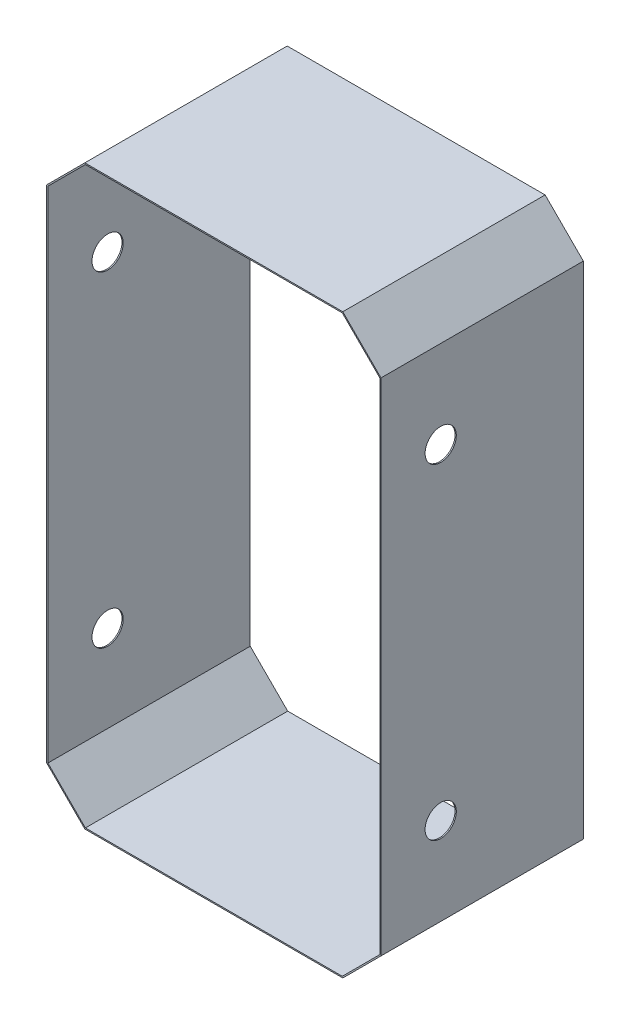
ISO-10303-21;
HEADER;
FILE_DESCRIPTION(('STEP AP214'),'2;1');
FILE_NAME('part.step','',(''),(''),'','','');
FILE_SCHEMA(('AUTOMOTIVE_DESIGN { 1 0 10303 214 1 1 1 1 }'));
ENDSEC;
DATA;
#1=APPLICATION_CONTEXT('core data for automotive mechanical design processes');
#2=APPLICATION_PROTOCOL_DEFINITION('international standard','automotive_design',2000,#1);
#3=PRODUCT_CONTEXT('',#1,'mechanical');
#4=PRODUCT('Part','Part','',(#3));
#5=PRODUCT_RELATED_PRODUCT_CATEGORY('part','',(#4));
#6=PRODUCT_DEFINITION_FORMATION('','',#4);
#7=PRODUCT_DEFINITION_CONTEXT('part definition',#1,'design');
#8=PRODUCT_DEFINITION('design','',#6,#7);
#9=PRODUCT_DEFINITION_SHAPE('','',#8);
#10=(LENGTH_UNIT() NAMED_UNIT(*) SI_UNIT(.MILLI.,.METRE.));
#11=(NAMED_UNIT(*) PLANE_ANGLE_UNIT() SI_UNIT($,.RADIAN.));
#12=(NAMED_UNIT(*) SI_UNIT($,.STERADIAN.) SOLID_ANGLE_UNIT());
#13=UNCERTAINTY_MEASURE_WITH_UNIT(LENGTH_MEASURE(1.E-05),#10,'distance_accuracy_value','');
#14=(GEOMETRIC_REPRESENTATION_CONTEXT(3) GLOBAL_UNCERTAINTY_ASSIGNED_CONTEXT((#13)) GLOBAL_UNIT_ASSIGNED_CONTEXT((#10,
#11,#12)) REPRESENTATION_CONTEXT('',''));
#15=CARTESIAN_POINT('',(0.,0.,0.));
#16=DIRECTION('',(0.,0.,1.));
#17=DIRECTION('',(1.,0.,0.));
#18=AXIS2_PLACEMENT_3D('',#15,#16,#17);
#19=CARTESIAN_POINT('',(0.,0.,162.));
#20=DIRECTION('',(0.,0.,-1.));
#21=DIRECTION('',(-1.,0.,0.));
#22=AXIS2_PLACEMENT_3D('',#19,#20,#21);
#23=PLANE('',#22);
#24=DIRECTION('',(0.,-1.,0.));
#25=VECTOR('',#24,1.);
#26=CARTESIAN_POINT('',(-57.7395039431081,-238.05581759051,162.));
#27=LINE('',#26,#25);
#28=CARTESIAN_POINT('',(-57.7395039431081,162.772609534235,162.));
#29=VERTEX_POINT('',#28);
#30=CARTESIAN_POINT('',(-57.7395039431081,-238.05581759051,162.));
#31=VERTEX_POINT('',#30);
#32=EDGE_CURVE('E216',#29,#31,#27,.T.);
#33=ORIENTED_EDGE('',*,*,#32,.T.);
#34=DIRECTION('',(0.707106781186553,-0.707106781186542,0.));
#35=VECTOR('',#34,1.);
#36=CARTESIAN_POINT('',(-27.1537175054806,-268.641604028137,162.));
#37=LINE('',#36,#35);
#38=CARTESIAN_POINT('',(-27.1537175054806,-268.641604028137,162.));
#39=VERTEX_POINT('',#38);
#40=EDGE_CURVE('E219',#31,#39,#37,.T.);
#41=ORIENTED_EDGE('',*,*,#40,.T.);
#42=DIRECTION('',(1.,0.,0.));
#43=VECTOR('',#42,1.);
#44=CARTESIAN_POINT('',(179.374709619265,-268.641604028137,162.));
#45=LINE('',#44,#43);
#46=CARTESIAN_POINT('',(179.374709619265,-268.641604028137,162.));
#47=VERTEX_POINT('',#46);
#48=EDGE_CURVE('E222',#39,#47,#45,.T.);
#49=ORIENTED_EDGE('',*,*,#48,.T.);
#50=DIRECTION('',(0.707106781186542,0.707106781186553,0.));
#51=VECTOR('',#50,1.);
#52=CARTESIAN_POINT('',(209.960496056892,-238.055817590509,162.));
#53=LINE('',#52,#51);
#54=CARTESIAN_POINT('',(209.960496056892,-238.055817590509,162.));
#55=VERTEX_POINT('',#54);
#56=EDGE_CURVE('E224',#47,#55,#53,.T.);
#57=ORIENTED_EDGE('',*,*,#56,.T.);
#58=DIRECTION('',(0.,1.,0.));
#59=VECTOR('',#58,1.);
#60=CARTESIAN_POINT('',(209.960496056892,162.772609534236,162.));
#61=LINE('',#60,#59);
#62=CARTESIAN_POINT('',(209.960496056892,162.772609534236,162.));
#63=VERTEX_POINT('',#62);
#64=EDGE_CURVE('E226',#55,#63,#61,.T.);
#65=ORIENTED_EDGE('',*,*,#64,.T.);
#66=DIRECTION('',(-0.707106781186553,0.707106781186542,0.));
#67=VECTOR('',#66,1.);
#68=CARTESIAN_POINT('',(179.374709619265,193.358395971863,162.));
#69=LINE('',#68,#67);
#70=CARTESIAN_POINT('',(179.374709619265,193.358395971863,162.));
#71=VERTEX_POINT('',#70);
#72=EDGE_CURVE('E228',#63,#71,#69,.T.);
#73=ORIENTED_EDGE('',*,*,#72,.T.);
#74=DIRECTION('',(-1.,0.,0.));
#75=VECTOR('',#74,1.);
#76=CARTESIAN_POINT('',(-27.1537175054807,193.358395971863,162.));
#77=LINE('',#76,#75);
#78=CARTESIAN_POINT('',(-27.1537175054807,193.358395971863,162.));
#79=VERTEX_POINT('',#78);
#80=EDGE_CURVE('E230',#71,#79,#77,.T.);
#81=ORIENTED_EDGE('',*,*,#80,.T.);
#82=DIRECTION('',(-0.707106781186543,-0.707106781186552,0.));
#83=VECTOR('',#82,1.);
#84=CARTESIAN_POINT('',(-57.7395039431081,162.772609534235,162.));
#85=LINE('',#84,#83);
#86=EDGE_CURVE('E232',#79,#29,#85,.T.);
#87=ORIENTED_EDGE('',*,*,#86,.T.);
#88=EDGE_LOOP('',(#33,#41,#49,#57,#65,#73,#81,#87));
#89=FACE_BOUND('',#88,.T.);
#90=DIRECTION('',(0.,-1.,0.));
#91=VECTOR('',#90,1.);
#92=CARTESIAN_POINT('',(-56.7395039431081,-237.641604028137,162.));
#93=LINE('',#92,#91);
#94=CARTESIAN_POINT('',(-56.7395039431081,162.358395971862,162.));
#95=VERTEX_POINT('',#94);
#96=CARTESIAN_POINT('',(-56.7395039431081,-237.641604028137,162.));
#97=VERTEX_POINT('',#96);
#98=EDGE_CURVE('E149',#95,#97,#93,.T.);
#99=ORIENTED_EDGE('',*,*,#98,.F.);
#100=DIRECTION('',(-0.707106781186542,-0.707106781186553,0.));
#101=VECTOR('',#100,1.);
#102=CARTESIAN_POINT('',(-56.7395039431081,162.358395971862,162.));
#103=LINE('',#102,#101);
#104=CARTESIAN_POINT('',(-26.7395039431077,192.358395971863,162.));
#105=VERTEX_POINT('',#104);
#106=EDGE_CURVE('E183',#105,#95,#103,.T.);
#107=ORIENTED_EDGE('',*,*,#106,.F.);
#108=DIRECTION('',(-1.,0.,0.));
#109=VECTOR('',#108,1.);
#110=CARTESIAN_POINT('',(-26.7395039431076,192.358395971863,162.));
#111=LINE('',#110,#109);
#112=CARTESIAN_POINT('',(178.960496056892,192.358395971863,162.));
#113=VERTEX_POINT('',#112);
#114=EDGE_CURVE('E181',#113,#105,#111,.T.);
#115=ORIENTED_EDGE('',*,*,#114,.F.);
#116=DIRECTION('',(-0.707106781186558,0.707106781186537,0.));
#117=VECTOR('',#116,1.);
#118=CARTESIAN_POINT('',(178.960496056892,192.358395971863,162.));
#119=LINE('',#118,#117);
#120=CARTESIAN_POINT('',(208.960496056892,162.358395971864,162.));
#121=VERTEX_POINT('',#120);
#122=EDGE_CURVE('E179',#121,#113,#119,.T.);
#123=ORIENTED_EDGE('',*,*,#122,.F.);
#124=DIRECTION('',(0.,1.,0.));
#125=VECTOR('',#124,1.);
#126=CARTESIAN_POINT('',(208.960496056892,162.358395971864,162.));
#127=LINE('',#126,#125);
#128=CARTESIAN_POINT('',(208.960496056892,-237.641604028136,162.));
#129=VERTEX_POINT('',#128);
#130=EDGE_CURVE('E177',#129,#121,#127,.T.);
#131=ORIENTED_EDGE('',*,*,#130,.F.);
#132=DIRECTION('',(0.707106781186543,0.707106781186552,0.));
#133=VECTOR('',#132,1.);
#134=CARTESIAN_POINT('',(208.960496056892,-237.641604028136,162.));
#135=LINE('',#134,#133);
#136=CARTESIAN_POINT('',(178.960496056892,-267.641604028137,162.));
#137=VERTEX_POINT('',#136);
#138=EDGE_CURVE('E172',#137,#129,#135,.T.);
#139=ORIENTED_EDGE('',*,*,#138,.F.);
#140=DIRECTION('',(1.,0.,0.));
#141=VECTOR('',#140,1.);
#142=CARTESIAN_POINT('',(178.960496056892,-267.641604028137,162.));
#143=LINE('',#142,#141);
#144=CARTESIAN_POINT('',(-26.7395039431076,-267.641604028137,162.));
#145=VERTEX_POINT('',#144);
#146=EDGE_CURVE('E170',#145,#137,#143,.T.);
#147=ORIENTED_EDGE('',*,*,#146,.F.);
#148=DIRECTION('',(0.707106781186553,-0.707106781186542,0.));
#149=VECTOR('',#148,1.);
#150=CARTESIAN_POINT('',(-26.7395039431076,-267.641604028137,162.));
#151=LINE('',#150,#149);
#152=EDGE_CURVE('E157',#97,#145,#151,.T.);
#153=ORIENTED_EDGE('',*,*,#152,.F.);
#154=EDGE_LOOP('',(#99,#107,#115,#123,#131,#139,#147,#153));
#155=FACE_BOUND('',#154,.T.);
#156=ADVANCED_FACE('F34',(#89,#155),#23,.F.);
#157=CARTESIAN_POINT('',(0.,0.,0.));
#158=DIRECTION('',(0.,0.,-1.));
#159=DIRECTION('',(-1.,0.,0.));
#160=AXIS2_PLACEMENT_3D('',#157,#158,#159);
#161=PLANE('',#160);
#162=DIRECTION('',(0.,-1.,0.));
#163=VECTOR('',#162,1.);
#164=CARTESIAN_POINT('',(-57.7395039431081,-238.05581759051,0.));
#165=LINE('',#164,#163);
#166=CARTESIAN_POINT('',(-57.7395039431081,162.772609534235,0.));
#167=VERTEX_POINT('',#166);
#168=CARTESIAN_POINT('',(-57.7395039431081,-238.05581759051,0.));
#169=VERTEX_POINT('',#168);
#170=EDGE_CURVE('E165',#167,#169,#165,.T.);
#171=ORIENTED_EDGE('',*,*,#170,.F.);
#172=DIRECTION('',(-0.707106781186543,-0.707106781186552,0.));
#173=VECTOR('',#172,1.);
#174=CARTESIAN_POINT('',(-57.7395039431081,162.772609534235,0.));
#175=LINE('',#174,#173);
#176=CARTESIAN_POINT('',(-27.1537175054807,193.358395971863,0.));
#177=VERTEX_POINT('',#176);
#178=EDGE_CURVE('E220',#177,#167,#175,.T.);
#179=ORIENTED_EDGE('',*,*,#178,.F.);
#180=DIRECTION('',(-1.,0.,0.));
#181=VECTOR('',#180,1.);
#182=CARTESIAN_POINT('',(-27.1537175054807,193.358395971863,0.));
#183=LINE('',#182,#181);
#184=CARTESIAN_POINT('',(179.374709619265,193.358395971863,0.));
#185=VERTEX_POINT('',#184);
#186=EDGE_CURVE('E247',#185,#177,#183,.T.);
#187=ORIENTED_EDGE('',*,*,#186,.F.);
#188=DIRECTION('',(-0.707106781186553,0.707106781186542,0.));
#189=VECTOR('',#188,1.);
#190=CARTESIAN_POINT('',(179.374709619265,193.358395971863,0.));
#191=LINE('',#190,#189);
#192=CARTESIAN_POINT('',(209.960496056892,162.772609534236,0.));
#193=VERTEX_POINT('',#192);
#194=EDGE_CURVE('E245',#193,#185,#191,.T.);
#195=ORIENTED_EDGE('',*,*,#194,.F.);
#196=DIRECTION('',(0.,1.,0.));
#197=VECTOR('',#196,1.);
#198=CARTESIAN_POINT('',(209.960496056892,162.772609534236,0.));
#199=LINE('',#198,#197);
#200=CARTESIAN_POINT('',(209.960496056892,-238.055817590509,0.));
#201=VERTEX_POINT('',#200);
#202=EDGE_CURVE('E243',#201,#193,#199,.T.);
#203=ORIENTED_EDGE('',*,*,#202,.F.);
#204=DIRECTION('',(0.707106781186542,0.707106781186553,0.));
#205=VECTOR('',#204,1.);
#206=CARTESIAN_POINT('',(209.960496056892,-238.055817590509,0.));
#207=LINE('',#206,#205);
#208=CARTESIAN_POINT('',(179.374709619265,-268.641604028137,0.));
#209=VERTEX_POINT('',#208);
#210=EDGE_CURVE('E241',#209,#201,#207,.T.);
#211=ORIENTED_EDGE('',*,*,#210,.F.);
#212=DIRECTION('',(1.,0.,0.));
#213=VECTOR('',#212,1.);
#214=CARTESIAN_POINT('',(179.374709619265,-268.641604028137,0.));
#215=LINE('',#214,#213);
#216=CARTESIAN_POINT('',(-27.1537175054806,-268.641604028137,0.));
#217=VERTEX_POINT('',#216);
#218=EDGE_CURVE('E239',#217,#209,#215,.T.);
#219=ORIENTED_EDGE('',*,*,#218,.F.);
#220=DIRECTION('',(0.707106781186553,-0.707106781186542,0.));
#221=VECTOR('',#220,1.);
#222=CARTESIAN_POINT('',(-27.1537175054806,-268.641604028137,0.));
#223=LINE('',#222,#221);
#224=EDGE_CURVE('E237',#169,#217,#223,.T.);
#225=ORIENTED_EDGE('',*,*,#224,.F.);
#226=EDGE_LOOP('',(#171,#179,#187,#195,#203,#211,#219,#225));
#227=FACE_BOUND('',#226,.T.);
#228=DIRECTION('',(-0.707106781186542,-0.707106781186553,0.));
#229=VECTOR('',#228,1.);
#230=CARTESIAN_POINT('',(-56.7395039431081,162.358395971862,0.));
#231=LINE('',#230,#229);
#232=CARTESIAN_POINT('',(-26.7395039431076,192.358395971863,0.));
#233=VERTEX_POINT('',#232);
#234=CARTESIAN_POINT('',(-56.7395039431081,162.358395971862,0.));
#235=VERTEX_POINT('',#234);
#236=EDGE_CURVE('E158',#233,#235,#231,.T.);
#237=ORIENTED_EDGE('',*,*,#236,.T.);
#238=DIRECTION('',(0.,-1.,0.));
#239=VECTOR('',#238,1.);
#240=CARTESIAN_POINT('',(-56.7395039431081,-237.641604028137,0.));
#241=LINE('',#240,#239);
#242=CARTESIAN_POINT('',(-56.7395039431081,-237.641604028137,0.));
#243=VERTEX_POINT('',#242);
#244=EDGE_CURVE('E59',#235,#243,#241,.T.);
#245=ORIENTED_EDGE('',*,*,#244,.T.);
#246=DIRECTION('',(0.707106781186553,-0.707106781186542,0.));
#247=VECTOR('',#246,1.);
#248=CARTESIAN_POINT('',(-26.7395039431076,-267.641604028137,0.));
#249=LINE('',#248,#247);
#250=CARTESIAN_POINT('',(-26.7395039431076,-267.641604028137,0.));
#251=VERTEX_POINT('',#250);
#252=EDGE_CURVE('E164',#243,#251,#249,.T.);
#253=ORIENTED_EDGE('',*,*,#252,.T.);
#254=DIRECTION('',(1.,0.,0.));
#255=VECTOR('',#254,1.);
#256=CARTESIAN_POINT('',(178.960496056892,-267.641604028137,0.));
#257=LINE('',#256,#255);
#258=CARTESIAN_POINT('',(178.960496056892,-267.641604028137,0.));
#259=VERTEX_POINT('',#258);
#260=EDGE_CURVE('E188',#251,#259,#257,.T.);
#261=ORIENTED_EDGE('',*,*,#260,.T.);
#262=DIRECTION('',(0.707106781186543,0.707106781186552,0.));
#263=VECTOR('',#262,1.);
#264=CARTESIAN_POINT('',(208.960496056892,-237.641604028136,0.));
#265=LINE('',#264,#263);
#266=CARTESIAN_POINT('',(208.960496056892,-237.641604028136,0.));
#267=VERTEX_POINT('',#266);
#268=EDGE_CURVE('E191',#259,#267,#265,.T.);
#269=ORIENTED_EDGE('',*,*,#268,.T.);
#270=DIRECTION('',(0.,1.,0.));
#271=VECTOR('',#270,1.);
#272=CARTESIAN_POINT('',(208.960496056892,162.358395971864,0.));
#273=LINE('',#272,#271);
#274=CARTESIAN_POINT('',(208.960496056892,162.358395971864,0.));
#275=VERTEX_POINT('',#274);
#276=EDGE_CURVE('E194',#267,#275,#273,.T.);
#277=ORIENTED_EDGE('',*,*,#276,.T.);
#278=DIRECTION('',(-0.707106781186558,0.707106781186537,0.));
#279=VECTOR('',#278,1.);
#280=CARTESIAN_POINT('',(178.960496056892,192.358395971863,0.));
#281=LINE('',#280,#279);
#282=CARTESIAN_POINT('',(178.960496056892,192.358395971863,0.));
#283=VERTEX_POINT('',#282);
#284=EDGE_CURVE('E197',#275,#283,#281,.T.);
#285=ORIENTED_EDGE('',*,*,#284,.T.);
#286=DIRECTION('',(-1.,0.,0.));
#287=VECTOR('',#286,1.);
#288=CARTESIAN_POINT('',(-26.7395039431076,192.358395971863,0.));
#289=LINE('',#288,#287);
#290=EDGE_CURVE('E200',#283,#233,#289,.T.);
#291=ORIENTED_EDGE('',*,*,#290,.T.);
#292=EDGE_LOOP('',(#237,#245,#253,#261,#269,#277,#285,#291));
#293=FACE_BOUND('',#292,.T.);
#294=ADVANCED_FACE('F312',(#227,#293),#161,.T.);
#295=CARTESIAN_POINT('',(-57.7395039431081,-238.05581759051,162.));
#296=DIRECTION('',(1.,0.,0.));
#297=DIRECTION('',(0.,0.,-1.));
#298=AXIS2_PLACEMENT_3D('',#295,#296,#297);
#299=PLANE('',#298);
#300=CARTESIAN_POINT('',(-57.7395039431081,-168.055817590509,114.2));
#301=DIRECTION('',(1.,0.,0.));
#302=DIRECTION('',(0.,1.,0.));
#303=AXIS2_PLACEMENT_3D('',#300,#301,#302);
#304=CIRCLE('',#303,12.5);
#305=CARTESIAN_POINT('',(-57.7395039431081,-155.555817590509,114.2));
#306=VERTEX_POINT('',#305);
#307=EDGE_CURVE('E271',#306,#306,#304,.T.);
#308=ORIENTED_EDGE('',*,*,#307,.T.);
#309=EDGE_LOOP('',(#308));
#310=FACE_BOUND('',#309,.T.);
#311=CARTESIAN_POINT('',(-57.7395039431081,92.7726095342363,114.2));
#312=DIRECTION('',(1.,0.,0.));
#313=DIRECTION('',(0.,1.,0.));
#314=AXIS2_PLACEMENT_3D('',#311,#312,#313);
#315=CIRCLE('',#314,12.5);
#316=CARTESIAN_POINT('',(-57.7395039431081,105.272609534236,114.2));
#317=VERTEX_POINT('',#316);
#318=EDGE_CURVE('E282',#317,#317,#315,.T.);
#319=ORIENTED_EDGE('',*,*,#318,.T.);
#320=EDGE_LOOP('',(#319));
#321=FACE_BOUND('',#320,.T.);
#322=ORIENTED_EDGE('',*,*,#170,.T.);
#323=DIRECTION('',(0.,0.,-1.));
#324=VECTOR('',#323,1.);
#325=CARTESIAN_POINT('',(-57.7395039431081,-238.05581759051,162.));
#326=LINE('',#325,#324);
#327=EDGE_CURVE('E11',#31,#169,#326,.T.);
#328=ORIENTED_EDGE('',*,*,#327,.F.);
#329=ORIENTED_EDGE('',*,*,#32,.F.);
#330=DIRECTION('',(0.,0.,-1.));
#331=VECTOR('',#330,1.);
#332=CARTESIAN_POINT('',(-57.7395039431081,162.772609534235,162.));
#333=LINE('',#332,#331);
#334=EDGE_CURVE('E234',#29,#167,#333,.T.);
#335=ORIENTED_EDGE('',*,*,#334,.T.);
#336=EDGE_LOOP('',(#322,#328,#329,#335));
#337=FACE_BOUND('',#336,.T.);
#338=ADVANCED_FACE('F36',(#310,#321,#337),#299,.F.);
#339=CARTESIAN_POINT('',(-27.1537175054806,-268.641604028137,162.));
#340=DIRECTION('',(0.707106781186542,0.707106781186553,0.));
#341=DIRECTION('',(-0.707106781186553,0.707106781186542,0.));
#342=AXIS2_PLACEMENT_3D('',#339,#340,#341);
#343=PLANE('',#342);
#344=ORIENTED_EDGE('',*,*,#224,.T.);
#345=DIRECTION('',(0.,0.,-1.));
#346=VECTOR('',#345,1.);
#347=CARTESIAN_POINT('',(-27.1537175054806,-268.641604028137,162.));
#348=LINE('',#347,#346);
#349=EDGE_CURVE('E43',#39,#217,#348,.T.);
#350=ORIENTED_EDGE('',*,*,#349,.F.);
#351=ORIENTED_EDGE('',*,*,#40,.F.);
#352=ORIENTED_EDGE('',*,*,#327,.T.);
#353=EDGE_LOOP('',(#344,#350,#351,#352));
#354=FACE_BOUND('',#353,.T.);
#355=ADVANCED_FACE('F367',(#354),#343,.F.);
#356=CARTESIAN_POINT('',(179.374709619265,-268.641604028137,162.));
#357=DIRECTION('',(0.,1.,0.));
#358=DIRECTION('',(0.,0.,1.));
#359=AXIS2_PLACEMENT_3D('',#356,#357,#358);
#360=PLANE('',#359);
#361=ORIENTED_EDGE('',*,*,#218,.T.);
#362=DIRECTION('',(0.,0.,-1.));
#363=VECTOR('',#362,1.);
#364=CARTESIAN_POINT('',(179.374709619265,-268.641604028137,162.));
#365=LINE('',#364,#363);
#366=EDGE_CURVE('E264',#47,#209,#365,.T.);
#367=ORIENTED_EDGE('',*,*,#366,.F.);
#368=ORIENTED_EDGE('',*,*,#48,.F.);
#369=ORIENTED_EDGE('',*,*,#349,.T.);
#370=EDGE_LOOP('',(#361,#367,#368,#369));
#371=FACE_BOUND('',#370,.T.);
#372=ADVANCED_FACE('F364',(#371),#360,.F.);
#373=CARTESIAN_POINT('',(209.960496056892,-238.055817590509,162.));
#374=DIRECTION('',(-0.707106781186553,0.707106781186542,0.));
#375=DIRECTION('',(-0.707106781186542,-0.707106781186553,0.));
#376=AXIS2_PLACEMENT_3D('',#373,#374,#375);
#377=PLANE('',#376);
#378=ORIENTED_EDGE('',*,*,#210,.T.);
#379=DIRECTION('',(0.,0.,-1.));
#380=VECTOR('',#379,1.);
#381=CARTESIAN_POINT('',(209.960496056892,-238.055817590509,162.));
#382=LINE('',#381,#380);
#383=EDGE_CURVE('E261',#55,#201,#382,.T.);
#384=ORIENTED_EDGE('',*,*,#383,.F.);
#385=ORIENTED_EDGE('',*,*,#56,.F.);
#386=ORIENTED_EDGE('',*,*,#366,.T.);
#387=EDGE_LOOP('',(#378,#384,#385,#386));
#388=FACE_BOUND('',#387,.T.);
#389=ADVANCED_FACE('F360',(#388),#377,.F.);
#390=CARTESIAN_POINT('',(209.960496056892,162.772609534236,162.));
#391=DIRECTION('',(-1.,0.,0.));
#392=DIRECTION('',(0.,-1.,0.));
#393=AXIS2_PLACEMENT_3D('',#390,#391,#392);
#394=PLANE('',#393);
#395=CARTESIAN_POINT('',(209.960496056892,-168.055817590509,114.2));
#396=DIRECTION('',(1.,0.,0.));
#397=DIRECTION('',(0.,1.,0.));
#398=AXIS2_PLACEMENT_3D('',#395,#396,#397);
#399=CIRCLE('',#398,12.5);
#400=CARTESIAN_POINT('',(209.960496056892,-155.555817590509,114.2));
#401=VERTEX_POINT('',#400);
#402=EDGE_CURVE('E277',#401,#401,#399,.T.);
#403=ORIENTED_EDGE('',*,*,#402,.F.);
#404=EDGE_LOOP('',(#403));
#405=FACE_BOUND('',#404,.T.);
#406=CARTESIAN_POINT('',(209.960496056892,92.7726095342363,114.2));
#407=DIRECTION('',(1.,0.,0.));
#408=DIRECTION('',(0.,1.,0.));
#409=AXIS2_PLACEMENT_3D('',#406,#407,#408);
#410=CIRCLE('',#409,12.5);
#411=CARTESIAN_POINT('',(209.960496056892,105.272609534236,114.2));
#412=VERTEX_POINT('',#411);
#413=EDGE_CURVE('E287',#412,#412,#410,.T.);
#414=ORIENTED_EDGE('',*,*,#413,.F.);
#415=EDGE_LOOP('',(#414));
#416=FACE_BOUND('',#415,.T.);
#417=ORIENTED_EDGE('',*,*,#202,.T.);
#418=DIRECTION('',(0.,0.,-1.));
#419=VECTOR('',#418,1.);
#420=CARTESIAN_POINT('',(209.960496056892,162.772609534236,162.));
#421=LINE('',#420,#419);
#422=EDGE_CURVE('E258',#63,#193,#421,.T.);
#423=ORIENTED_EDGE('',*,*,#422,.F.);
#424=ORIENTED_EDGE('',*,*,#64,.F.);
#425=ORIENTED_EDGE('',*,*,#383,.T.);
#426=EDGE_LOOP('',(#417,#423,#424,#425));
#427=FACE_BOUND('',#426,.T.);
#428=ADVANCED_FACE('F356',(#405,#416,#427),#394,.F.);
#429=CARTESIAN_POINT('',(179.374709619265,193.358395971863,162.));
#430=DIRECTION('',(-0.707106781186542,-0.707106781186553,0.));
#431=DIRECTION('',(0.707106781186553,-0.707106781186542,0.));
#432=AXIS2_PLACEMENT_3D('',#429,#430,#431);
#433=PLANE('',#432);
#434=ORIENTED_EDGE('',*,*,#194,.T.);
#435=DIRECTION('',(0.,0.,-1.));
#436=VECTOR('',#435,1.);
#437=CARTESIAN_POINT('',(179.374709619265,193.358395971863,162.));
#438=LINE('',#437,#436);
#439=EDGE_CURVE('E255',#71,#185,#438,.T.);
#440=ORIENTED_EDGE('',*,*,#439,.F.);
#441=ORIENTED_EDGE('',*,*,#72,.F.);
#442=ORIENTED_EDGE('',*,*,#422,.T.);
#443=EDGE_LOOP('',(#434,#440,#441,#442));
#444=FACE_BOUND('',#443,.T.);
#445=ADVANCED_FACE('F352',(#444),#433,.F.);
#446=CARTESIAN_POINT('',(-27.1537175054807,193.358395971863,162.));
#447=DIRECTION('',(0.,-1.,0.));
#448=DIRECTION('',(0.,0.,-1.));
#449=AXIS2_PLACEMENT_3D('',#446,#447,#448);
#450=PLANE('',#449);
#451=ORIENTED_EDGE('',*,*,#186,.T.);
#452=DIRECTION('',(0.,0.,-1.));
#453=VECTOR('',#452,1.);
#454=CARTESIAN_POINT('',(-27.1537175054807,193.358395971863,162.));
#455=LINE('',#454,#453);
#456=EDGE_CURVE('E252',#79,#177,#455,.T.);
#457=ORIENTED_EDGE('',*,*,#456,.F.);
#458=ORIENTED_EDGE('',*,*,#80,.F.);
#459=ORIENTED_EDGE('',*,*,#439,.T.);
#460=EDGE_LOOP('',(#451,#457,#458,#459));
#461=FACE_BOUND('',#460,.T.);
#462=ADVANCED_FACE('F348',(#461),#450,.F.);
#463=CARTESIAN_POINT('',(-57.7395039431081,162.772609534235,162.));
#464=DIRECTION('',(0.707106781186552,-0.707106781186543,0.));
#465=DIRECTION('',(0.707106781186543,0.707106781186552,0.));
#466=AXIS2_PLACEMENT_3D('',#463,#464,#465);
#467=PLANE('',#466);
#468=ORIENTED_EDGE('',*,*,#178,.T.);
#469=ORIENTED_EDGE('',*,*,#334,.F.);
#470=ORIENTED_EDGE('',*,*,#86,.F.);
#471=ORIENTED_EDGE('',*,*,#456,.T.);
#472=EDGE_LOOP('',(#468,#469,#470,#471));
#473=FACE_BOUND('',#472,.T.);
#474=ADVANCED_FACE('F345',(#473),#467,.F.);
#475=CARTESIAN_POINT('',(-56.7395039431081,-237.641604028137,162.));
#476=DIRECTION('',(1.,0.,0.));
#477=DIRECTION('',(0.,1.,0.));
#478=AXIS2_PLACEMENT_3D('',#475,#476,#477);
#479=PLANE('',#478);
#480=CARTESIAN_POINT('',(-56.7395039431081,-168.055817590509,114.2));
#481=DIRECTION('',(1.,0.,0.));
#482=DIRECTION('',(0.,1.,0.));
#483=AXIS2_PLACEMENT_3D('',#480,#481,#482);
#484=CIRCLE('',#483,12.5);
#485=CARTESIAN_POINT('',(-56.7395039431081,-155.555817590509,114.2));
#486=VERTEX_POINT('',#485);
#487=EDGE_CURVE('E186',#486,#486,#484,.T.);
#488=ORIENTED_EDGE('',*,*,#487,.F.);
#489=EDGE_LOOP('',(#488));
#490=FACE_BOUND('',#489,.T.);
#491=CARTESIAN_POINT('',(-56.7395039431081,92.7726095342363,114.2));
#492=DIRECTION('',(1.,0.,0.));
#493=DIRECTION('',(0.,1.,0.));
#494=AXIS2_PLACEMENT_3D('',#491,#492,#493);
#495=CIRCLE('',#494,12.5);
#496=CARTESIAN_POINT('',(-56.7395039431081,105.272609534236,114.2));
#497=VERTEX_POINT('',#496);
#498=EDGE_CURVE('E270',#497,#497,#495,.T.);
#499=ORIENTED_EDGE('',*,*,#498,.F.);
#500=EDGE_LOOP('',(#499));
#501=FACE_BOUND('',#500,.T.);
#502=ORIENTED_EDGE('',*,*,#244,.F.);
#503=DIRECTION('',(0.,0.,-1.));
#504=VECTOR('',#503,1.);
#505=CARTESIAN_POINT('',(-56.7395039431081,162.358395971862,162.));
#506=LINE('',#505,#504);
#507=EDGE_CURVE('E153',#95,#235,#506,.T.);
#508=ORIENTED_EDGE('',*,*,#507,.F.);
#509=ORIENTED_EDGE('',*,*,#98,.T.);
#510=DIRECTION('',(0.,0.,-1.));
#511=VECTOR('',#510,1.);
#512=CARTESIAN_POINT('',(-56.7395039431081,-237.641604028137,162.));
#513=LINE('',#512,#511);
#514=EDGE_CURVE('E152',#97,#243,#513,.T.);
#515=ORIENTED_EDGE('',*,*,#514,.T.);
#516=EDGE_LOOP('',(#502,#508,#509,#515));
#517=FACE_BOUND('',#516,.T.);
#518=ADVANCED_FACE('F151',(#490,#501,#517),#479,.T.);
#519=CARTESIAN_POINT('',(-26.7395039431076,-267.641604028137,162.));
#520=DIRECTION('',(0.707106781186542,0.707106781186553,0.));
#521=DIRECTION('',(-0.707106781186553,0.707106781186542,0.));
#522=AXIS2_PLACEMENT_3D('',#519,#520,#521);
#523=PLANE('',#522);
#524=ORIENTED_EDGE('',*,*,#252,.F.);
#525=ORIENTED_EDGE('',*,*,#514,.F.);
#526=ORIENTED_EDGE('',*,*,#152,.T.);
#527=DIRECTION('',(0.,0.,-1.));
#528=VECTOR('',#527,1.);
#529=CARTESIAN_POINT('',(-26.7395039431076,-267.641604028137,162.));
#530=LINE('',#529,#528);
#531=EDGE_CURVE('E166',#145,#251,#530,.T.);
#532=ORIENTED_EDGE('',*,*,#531,.T.);
#533=EDGE_LOOP('',(#524,#525,#526,#532));
#534=FACE_BOUND('',#533,.T.);
#535=ADVANCED_FACE('F161',(#534),#523,.T.);
#536=CARTESIAN_POINT('',(178.960496056892,-267.641604028137,162.));
#537=DIRECTION('',(0.,1.,0.));
#538=DIRECTION('',(0.,0.,1.));
#539=AXIS2_PLACEMENT_3D('',#536,#537,#538);
#540=PLANE('',#539);
#541=ORIENTED_EDGE('',*,*,#260,.F.);
#542=ORIENTED_EDGE('',*,*,#531,.F.);
#543=ORIENTED_EDGE('',*,*,#146,.T.);
#544=DIRECTION('',(0.,0.,-1.));
#545=VECTOR('',#544,1.);
#546=CARTESIAN_POINT('',(178.960496056892,-267.641604028137,162.));
#547=LINE('',#546,#545);
#548=EDGE_CURVE('E213',#137,#259,#547,.T.);
#549=ORIENTED_EDGE('',*,*,#548,.T.);
#550=EDGE_LOOP('',(#541,#542,#543,#549));
#551=FACE_BOUND('',#550,.T.);
#552=ADVANCED_FACE('F418',(#551),#540,.T.);
#553=CARTESIAN_POINT('',(208.960496056892,-237.641604028136,162.));
#554=DIRECTION('',(-0.707106781186552,0.707106781186543,0.));
#555=DIRECTION('',(-0.707106781186543,-0.707106781186552,0.));
#556=AXIS2_PLACEMENT_3D('',#553,#554,#555);
#557=PLANE('',#556);
#558=ORIENTED_EDGE('',*,*,#268,.F.);
#559=ORIENTED_EDGE('',*,*,#548,.F.);
#560=ORIENTED_EDGE('',*,*,#138,.T.);
#561=DIRECTION('',(0.,0.,-1.));
#562=VECTOR('',#561,1.);
#563=CARTESIAN_POINT('',(208.960496056892,-237.641604028136,162.));
#564=LINE('',#563,#562);
#565=EDGE_CURVE('E211',#129,#267,#564,.T.);
#566=ORIENTED_EDGE('',*,*,#565,.T.);
#567=EDGE_LOOP('',(#558,#559,#560,#566));
#568=FACE_BOUND('',#567,.T.);
#569=ADVANCED_FACE('F302',(#568),#557,.T.);
#570=CARTESIAN_POINT('',(208.960496056892,162.358395971864,162.));
#571=DIRECTION('',(-1.,0.,0.));
#572=DIRECTION('',(0.,-1.,0.));
#573=AXIS2_PLACEMENT_3D('',#570,#571,#572);
#574=PLANE('',#573);
#575=CARTESIAN_POINT('',(208.960496056892,-168.055817590509,114.2));
#576=DIRECTION('',(-1.,0.,0.));
#577=DIRECTION('',(0.,-1.,0.));
#578=AXIS2_PLACEMENT_3D('',#575,#576,#577);
#579=CIRCLE('',#578,12.5);
#580=CARTESIAN_POINT('',(208.960496056892,-180.555817590509,114.2));
#581=VERTEX_POINT('',#580);
#582=EDGE_CURVE('E38',#581,#581,#579,.T.);
#583=ORIENTED_EDGE('',*,*,#582,.F.);
#584=EDGE_LOOP('',(#583));
#585=FACE_BOUND('',#584,.T.);
#586=CARTESIAN_POINT('',(208.960496056892,92.7726095342363,114.2));
#587=DIRECTION('',(-1.,0.,0.));
#588=DIRECTION('',(0.,-1.,0.));
#589=AXIS2_PLACEMENT_3D('',#586,#587,#588);
#590=CIRCLE('',#589,12.5);
#591=CARTESIAN_POINT('',(208.960496056892,80.2726095342363,114.2));
#592=VERTEX_POINT('',#591);
#593=EDGE_CURVE('E268',#592,#592,#590,.T.);
#594=ORIENTED_EDGE('',*,*,#593,.F.);
#595=EDGE_LOOP('',(#594));
#596=FACE_BOUND('',#595,.T.);
#597=ORIENTED_EDGE('',*,*,#276,.F.);
#598=ORIENTED_EDGE('',*,*,#565,.F.);
#599=ORIENTED_EDGE('',*,*,#130,.T.);
#600=DIRECTION('',(0.,0.,-1.));
#601=VECTOR('',#600,1.);
#602=CARTESIAN_POINT('',(208.960496056892,162.358395971864,162.));
#603=LINE('',#602,#601);
#604=EDGE_CURVE('E209',#121,#275,#603,.T.);
#605=ORIENTED_EDGE('',*,*,#604,.T.);
#606=EDGE_LOOP('',(#597,#598,#599,#605));
#607=FACE_BOUND('',#606,.T.);
#608=ADVANCED_FACE('F298',(#585,#596,#607),#574,.T.);
#609=CARTESIAN_POINT('',(178.960496056892,192.358395971863,162.));
#610=DIRECTION('',(-0.707106781186537,-0.707106781186558,0.));
#611=DIRECTION('',(0.707106781186558,-0.707106781186537,0.));
#612=AXIS2_PLACEMENT_3D('',#609,#610,#611);
#613=PLANE('',#612);
#614=ORIENTED_EDGE('',*,*,#284,.F.);
#615=ORIENTED_EDGE('',*,*,#604,.F.);
#616=ORIENTED_EDGE('',*,*,#122,.T.);
#617=DIRECTION('',(0.,0.,-1.));
#618=VECTOR('',#617,1.);
#619=CARTESIAN_POINT('',(178.960496056892,192.358395971863,162.));
#620=LINE('',#619,#618);
#621=EDGE_CURVE('E207',#113,#283,#620,.T.);
#622=ORIENTED_EDGE('',*,*,#621,.T.);
#623=EDGE_LOOP('',(#614,#615,#616,#622));
#624=FACE_BOUND('',#623,.T.);
#625=ADVANCED_FACE('F301',(#624),#613,.T.);
#626=CARTESIAN_POINT('',(-26.7395039431076,192.358395971863,162.));
#627=DIRECTION('',(0.,-1.,0.));
#628=DIRECTION('',(1.,0.,0.));
#629=AXIS2_PLACEMENT_3D('',#626,#627,#628);
#630=PLANE('',#629);
#631=ORIENTED_EDGE('',*,*,#290,.F.);
#632=ORIENTED_EDGE('',*,*,#621,.F.);
#633=ORIENTED_EDGE('',*,*,#114,.T.);
#634=DIRECTION('',(0.,0.,-1.));
#635=VECTOR('',#634,1.);
#636=CARTESIAN_POINT('',(-26.7395039431076,192.358395971863,162.));
#637=LINE('',#636,#635);
#638=EDGE_CURVE('E51',#105,#233,#637,.T.);
#639=ORIENTED_EDGE('',*,*,#638,.T.);
#640=EDGE_LOOP('',(#631,#632,#633,#639));
#641=FACE_BOUND('',#640,.T.);
#642=ADVANCED_FACE('F322',(#641),#630,.T.);
#643=CARTESIAN_POINT('',(-56.7395039431081,162.358395971862,162.));
#644=DIRECTION('',(0.707106781186553,-0.707106781186542,0.));
#645=DIRECTION('',(0.707106781186542,0.707106781186553,0.));
#646=AXIS2_PLACEMENT_3D('',#643,#644,#645);
#647=PLANE('',#646);
#648=ORIENTED_EDGE('',*,*,#236,.F.);
#649=ORIENTED_EDGE('',*,*,#638,.F.);
#650=ORIENTED_EDGE('',*,*,#106,.T.);
#651=ORIENTED_EDGE('',*,*,#507,.T.);
#652=EDGE_LOOP('',(#648,#649,#650,#651));
#653=FACE_BOUND('',#652,.T.);
#654=ADVANCED_FACE('F323',(#653),#647,.T.);
#655=CARTESIAN_POINT('',(-57.7395039431081,92.7726095342363,114.2));
#656=DIRECTION('',(1.,0.,0.));
#657=DIRECTION('',(0.,1.,0.));
#658=AXIS2_PLACEMENT_3D('',#655,#656,#657);
#659=CYLINDRICAL_SURFACE('',#658,12.5);
#660=ORIENTED_EDGE('',*,*,#593,.T.);
#661=EDGE_LOOP('',(#660));
#662=FACE_BOUND('',#661,.T.);
#663=ORIENTED_EDGE('',*,*,#413,.T.);
#664=EDGE_LOOP('',(#663));
#665=FACE_BOUND('',#664,.T.);
#666=ADVANCED_FACE('F325',(#662,#665),#659,.F.);
#667=CARTESIAN_POINT('',(-57.7395039431081,-168.055817590509,114.2));
#668=DIRECTION('',(1.,0.,0.));
#669=DIRECTION('',(0.,1.,0.));
#670=AXIS2_PLACEMENT_3D('',#667,#668,#669);
#671=CYLINDRICAL_SURFACE('',#670,12.5);
#672=ORIENTED_EDGE('',*,*,#582,.T.);
#673=EDGE_LOOP('',(#672));
#674=FACE_BOUND('',#673,.T.);
#675=ORIENTED_EDGE('',*,*,#402,.T.);
#676=EDGE_LOOP('',(#675));
#677=FACE_BOUND('',#676,.T.);
#678=ADVANCED_FACE('F295',(#674,#677),#671,.F.);
#679=ORIENTED_EDGE('',*,*,#498,.T.);
#680=EDGE_LOOP('',(#679));
#681=FACE_BOUND('',#680,.T.);
#682=ORIENTED_EDGE('',*,*,#318,.F.);
#683=EDGE_LOOP('',(#682));
#684=FACE_BOUND('',#683,.T.);
#685=ADVANCED_FACE('F332',(#681,#684),#659,.F.);
#686=ORIENTED_EDGE('',*,*,#487,.T.);
#687=EDGE_LOOP('',(#686));
#688=FACE_BOUND('',#687,.T.);
#689=ORIENTED_EDGE('',*,*,#307,.F.);
#690=EDGE_LOOP('',(#689));
#691=FACE_BOUND('',#690,.T.);
#692=ADVANCED_FACE('F404',(#688,#691),#671,.F.);
#693=CLOSED_SHELL('',(#156,#294,#338,#355,#372,#389,#428,#445,#462,#474,#518,#535,#552,#569,
#608,#625,#642,#654,#666,#678,#685,#692));
#694=MANIFOLD_SOLID_BREP('B2',#693);
#695=ADVANCED_BREP_SHAPE_REPRESENTATION('',(#18,#694),#14);
#696=SHAPE_DEFINITION_REPRESENTATION(#9,#695);
ENDSEC;
END-ISO-10303-21;
